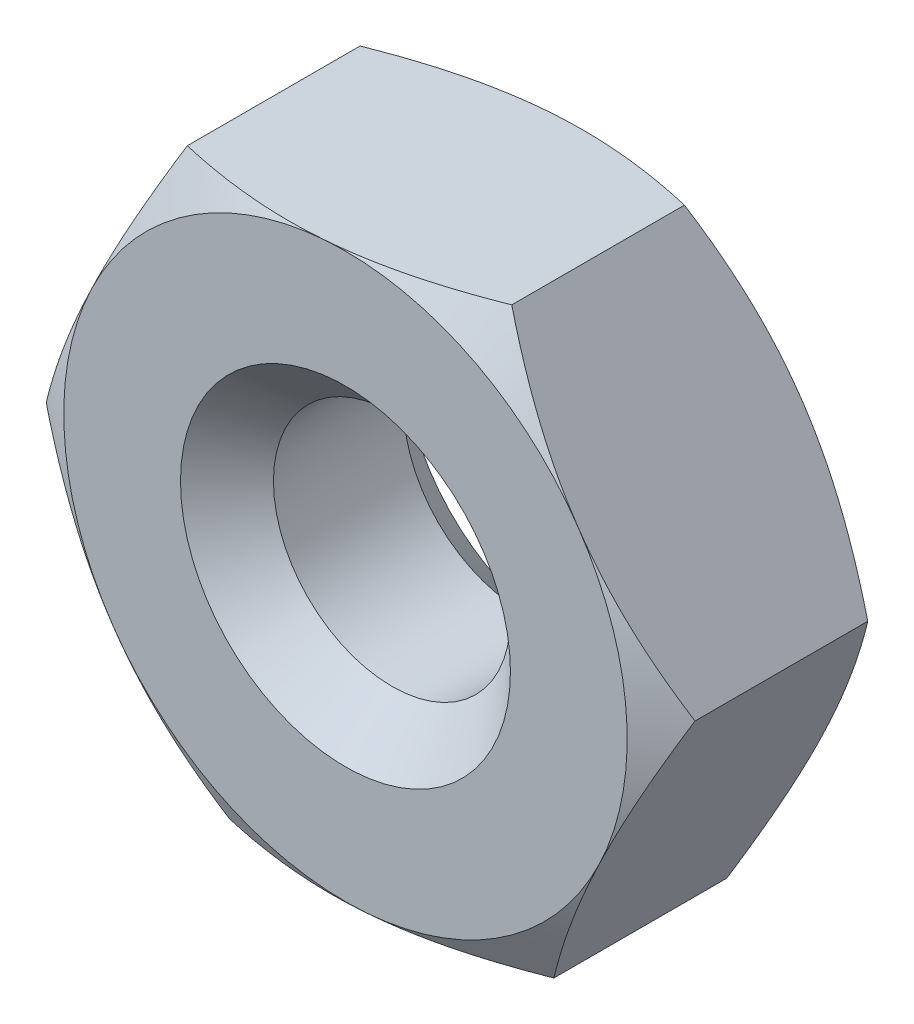
ISO-10303-21;
HEADER;
FILE_DESCRIPTION(('STEP AP214'),'2;1');
FILE_NAME('part.step','',(''),(''),'','','');
FILE_SCHEMA(('AUTOMOTIVE_DESIGN { 1 0 10303 214 1 1 1 1 }'));
ENDSEC;
DATA;
#1=APPLICATION_CONTEXT('core data for automotive mechanical design processes');
#2=APPLICATION_PROTOCOL_DEFINITION('international standard','automotive_design',2000,#1);
#3=PRODUCT_CONTEXT('',#1,'mechanical');
#4=PRODUCT('Part','Part','',(#3));
#5=PRODUCT_RELATED_PRODUCT_CATEGORY('part','',(#4));
#6=PRODUCT_DEFINITION_FORMATION('','',#4);
#7=PRODUCT_DEFINITION_CONTEXT('part definition',#1,'design');
#8=PRODUCT_DEFINITION('design','',#6,#7);
#9=PRODUCT_DEFINITION_SHAPE('','',#8);
#10=(LENGTH_UNIT() NAMED_UNIT(*) SI_UNIT(.MILLI.,.METRE.));
#11=(NAMED_UNIT(*) PLANE_ANGLE_UNIT() SI_UNIT($,.RADIAN.));
#12=(NAMED_UNIT(*) SI_UNIT($,.STERADIAN.) SOLID_ANGLE_UNIT());
#13=UNCERTAINTY_MEASURE_WITH_UNIT(LENGTH_MEASURE(1.E-05),#10,'distance_accuracy_value','');
#14=(GEOMETRIC_REPRESENTATION_CONTEXT(3) GLOBAL_UNCERTAINTY_ASSIGNED_CONTEXT((#13)) GLOBAL_UNIT_ASSIGNED_CONTEXT((#10,
#11,#12)) REPRESENTATION_CONTEXT('',''));
#15=CARTESIAN_POINT('',(0.,0.,0.));
#16=DIRECTION('',(0.,0.,1.));
#17=DIRECTION('',(1.,0.,0.));
#18=AXIS2_PLACEMENT_3D('',#15,#16,#17);
#19=CARTESIAN_POINT('',(3.49015866216891,0.262283268409103,2.4));
#20=DIRECTION('',(-0.826121265849152,-0.563492372718385,0.));
#21=DIRECTION('',(0.563492372718385,-0.826121265849152,0.));
#22=AXIS2_PLACEMENT_3D('',#19,#20,#21);
#23=PLANE('',#22);
#24=CARTESIAN_POINT('',(1.51779893885117,3.15390769888113,0.270795832655984));
#25=CARTESIAN_POINT('',(1.60446851110771,3.02684373100918,0.226377888360156));
#26=CARTESIAN_POINT('',(1.69188620879752,2.898682956224,0.185981216004486));
#27=CARTESIAN_POINT('',(1.86823537079749,2.64014211344375,0.11546802554396));
#28=CARTESIAN_POINT('',(1.95716996886114,2.50975745113557,0.085376453091123));
#29=CARTESIAN_POINT('',(2.13393697396114,2.2506040196364,0.0385339981108596));
#30=CARTESIAN_POINT('',(2.22174218137217,2.12187512709681,0.0214713634114672));
#31=CARTESIAN_POINT('',(2.39776580375113,1.86381154934589,0.00110118863020623));
#32=CARTESIAN_POINT('',(2.48598357881127,1.73447780228646,-0.00222321872384832));
#33=CARTESIAN_POINT('',(2.65082700847021,1.49280520941745,0.00468831345945599));
#34=CARTESIAN_POINT('',(2.72747732462637,1.38043020795082,0.0132272360881123));
#35=CARTESIAN_POINT('',(2.88027857454631,1.15641233633665,0.0402919721000541));
#36=CARTESIAN_POINT('',(2.95642897969903,1.0447702411718,0.0588270331292646));
#37=CARTESIAN_POINT('',(3.10954534227339,0.820290391228264,0.105163788200715));
#38=CARTESIAN_POINT('',(3.18649191783216,0.70748105168617,0.133161925597926));
#39=CARTESIAN_POINT('',(3.33923734968145,0.483545013469251,0.19670689328355));
#40=CARTESIAN_POINT('',(3.41503816325928,0.37241544526725,0.232238790192095));
#41=CARTESIAN_POINT('',(3.4902950809723,0.262083268409103,0.270795832655984));
#42=B_SPLINE_CURVE_WITH_KNOTS('',3,(#24,#25,#26,#27,#28,#29,#30,#31,#32,#33,#34,#35,#36,#37,#38,
#39,#40,#41),.UNSPECIFIED.,.F.,.F.,(4,2,2,2,2,2,2,2,4),(0.,0.480468435576784,0.96209185764543,
1.43179497545154,1.9009212380191,2.30941743115684,2.71829218293029,3.1362371228918,
3.55336123263816),.UNSPECIFIED.);
#43=CARTESIAN_POINT('',(1.51793535765456,3.15370769888113,0.270725942163688));
#44=VERTEX_POINT('',#43);
#45=CARTESIAN_POINT('',(2.50404700991173,1.70799548364512,0.));
#46=VERTEX_POINT('',#45);
#47=EDGE_CURVE('E124',#44,#46,#42,.T.);
#48=ORIENTED_EDGE('',*,*,#47,.F.);
#49=DIRECTION('',(0.,0.,-1.));
#50=VECTOR('',#49,1.);
#51=CARTESIAN_POINT('',(1.51793535765456,3.15370769888113,2.4));
#52=LINE('',#51,#50);
#53=CARTESIAN_POINT('',(1.51793535765456,3.15370769888113,2.12927405783631));
#54=VERTEX_POINT('',#53);
#55=EDGE_CURVE('E247',#54,#44,#52,.T.);
#56=ORIENTED_EDGE('',*,*,#55,.F.);
#57=CARTESIAN_POINT('',(3.4902950809723,0.262083268409103,2.12920416734402));
#58=CARTESIAN_POINT('',(3.40362550871575,0.389147236281054,2.17362211163984));
#59=CARTESIAN_POINT('',(3.31620781102594,0.51730801106624,2.21401878399551));
#60=CARTESIAN_POINT('',(3.13985864902597,0.775848853846483,2.28453197445604));
#61=CARTESIAN_POINT('',(3.05092405096233,0.906233516154665,2.31462354690888));
#62=CARTESIAN_POINT('',(2.87415704586232,1.16538694765383,2.36146600188914));
#63=CARTESIAN_POINT('',(2.7863518384513,1.29411584019342,2.37852863658853));
#64=CARTESIAN_POINT('',(2.61032821607233,1.55217941794435,2.39889881136979));
#65=CARTESIAN_POINT('',(2.5221104410122,1.68151316500377,2.40222321872385));
#66=CARTESIAN_POINT('',(2.35726701135325,1.92318575787279,2.39531168654054));
#67=CARTESIAN_POINT('',(2.28061669519709,2.03556075933942,2.38677276391189));
#68=CARTESIAN_POINT('',(2.12781544527715,2.25957863095359,2.35970802789995));
#69=CARTESIAN_POINT('',(2.05166504012443,2.37122072611843,2.34117296687074));
#70=CARTESIAN_POINT('',(1.89854867755007,2.59570057606197,2.29483621179928));
#71=CARTESIAN_POINT('',(1.8216021019913,2.70850991560407,2.26683807440207));
#72=CARTESIAN_POINT('',(1.66885667014201,2.93244595382099,2.20329310671645));
#73=CARTESIAN_POINT('',(1.59305585656418,3.04357552202299,2.1677612098079));
#74=CARTESIAN_POINT('',(1.51779893885117,3.15390769888113,2.12920416734402));
#75=B_SPLINE_CURVE_WITH_KNOTS('',3,(#57,#58,#59,#60,#61,#62,#63,#64,#65,#66,#67,#68,#69,#70,#71,
#72,#73,#74),.UNSPECIFIED.,.F.,.F.,(4,2,2,2,2,2,2,2,4),(0.,0.480468435576785,0.962091857645429,
1.43179497545154,1.90092123801909,2.30941743115684,2.71829218293029,3.1362371228918,
3.55336123263816),.UNSPECIFIED.);
#76=CARTESIAN_POINT('',(2.50404700991173,1.70799548364512,2.4));
#77=VERTEX_POINT('',#76);
#78=EDGE_CURVE('E228',#77,#54,#75,.T.);
#79=ORIENTED_EDGE('',*,*,#78,.F.);
#80=CARTESIAN_POINT('',(3.49015866216891,0.262283268409102,2.12927405783631));
#81=VERTEX_POINT('',#80);
#82=EDGE_CURVE('E233',#81,#77,#75,.T.);
#83=ORIENTED_EDGE('',*,*,#82,.F.);
#84=DIRECTION('',(0.,0.,-1.));
#85=VECTOR('',#84,1.);
#86=CARTESIAN_POINT('',(3.49015866216891,0.262283268409103,2.4));
#87=LINE('',#86,#85);
#88=CARTESIAN_POINT('',(3.49015866216891,0.262283268409103,0.270725942163688));
#89=VERTEX_POINT('',#88);
#90=EDGE_CURVE('E154',#81,#89,#87,.T.);
#91=ORIENTED_EDGE('',*,*,#90,.T.);
#92=EDGE_CURVE('E136',#46,#89,#42,.T.);
#93=ORIENTED_EDGE('',*,*,#92,.F.);
#94=EDGE_LOOP('',(#48,#56,#79,#83,#91,#93));
#95=FACE_BOUND('',#94,.T.);
#96=ADVANCED_FACE('F35',(#95),#23,.F.);
#97=CARTESIAN_POINT('',(1.51793535765456,3.15370769888113,2.4));
#98=DIRECTION('',(0.0749380766883149,-0.997188189191116,0.));
#99=DIRECTION('',(0.997188189191116,0.0749380766883149,0.));
#100=AXIS2_PLACEMENT_3D('',#97,#98,#99);
#101=PLANE('',#100);
#102=CARTESIAN_POINT('',(-1.97242330451435,2.89140940059552,0.270783842476596));
#103=CARTESIAN_POINT('',(-1.81904859325783,2.90293541544284,0.226366882893946));
#104=CARTESIAN_POINT('',(-1.66434996112251,2.91456092212673,0.185971256475435));
#105=CARTESIAN_POINT('',(-1.35227391838902,2.93801324404193,0.11546023685221));
#106=CARTESIAN_POINT('',(-1.19489096257049,2.94984047599314,0.0853697879345379));
#107=CARTESIAN_POINT('',(-0.88207552036306,2.97334836332225,0.0385295540985408));
#108=CARTESIAN_POINT('',(-0.726691164900777,2.98502540169075,0.02146802378493));
#109=CARTESIAN_POINT('',(-0.415191303979135,3.00843442389856,0.00109998357840421));
#110=CARTESIAN_POINT('',(-0.259076930764746,3.02016632265037,-0.00222339268335108));
#111=CARTESIAN_POINT('',(0.0326323891805468,3.04208809792379,0.00468976922606865));
#112=CARTESIAN_POINT('',(0.16827099997546,3.05228125577285,0.0132288914792515));
#113=CARTESIAN_POINT('',(0.438664535414926,3.07260116300242,0.0402930871421212));
#114=CARTESIAN_POINT('',(0.573418524795524,3.08272784209842,0.0588274060509915));
#115=CARTESIAN_POINT('',(0.844369576771844,3.10308964635149,0.105161844410828));
#116=CARTESIAN_POINT('',(0.980532345541723,3.11332219434872,0.13315837740453));
#117=CARTESIAN_POINT('',(1.25082702658867,3.13363467273174,0.196699526642058));
#118=CARTESIAN_POINT('',(1.38496240184229,3.14371486335807,0.232229212535161));
#119=CARTESIAN_POINT('',(1.51813535765456,3.15372272875764,0.270783842476596));
#120=B_SPLINE_CURVE_WITH_KNOTS('',3,(#102,#103,#104,#105,#106,#107,#108,#109,#110,#111,#112,
#113,#114,#115,#116,#117,#118,#119),.UNSPECIFIED.,.F.,.F.,(4,2,2,2,2,2,2,2,4),(0.,
0.480465591757972,0.962086092129981,1.43178663784245,1.90091035935246,2.30938817348878,
2.71824447695766,3.13616999231973,3.55327481524738),.UNSPECIFIED.);
#121=CARTESIAN_POINT('',(-1.97222330451435,2.89142443047203,0.270725942163687));
#122=VERTEX_POINT('',#121);
#123=CARTESIAN_POINT('',(-0.227143973429895,3.02256606467658,0.));
#124=VERTEX_POINT('',#123);
#125=EDGE_CURVE('E51',#122,#124,#120,.T.);
#126=ORIENTED_EDGE('',*,*,#125,.F.);
#127=DIRECTION('',(0.,0.,-1.));
#128=VECTOR('',#127,1.);
#129=CARTESIAN_POINT('',(-1.97222330451435,2.89142443047203,2.4));
#130=LINE('',#129,#128);
#131=CARTESIAN_POINT('',(-1.97222330451435,2.89142443047203,2.12927405783631));
#132=VERTEX_POINT('',#131);
#133=EDGE_CURVE('E244',#132,#122,#130,.T.);
#134=ORIENTED_EDGE('',*,*,#133,.F.);
#135=CARTESIAN_POINT('',(1.51813535765456,3.15372272875764,2.1292161575234));
#136=CARTESIAN_POINT('',(1.36476064639804,3.14219671391032,2.17363311710605));
#137=CARTESIAN_POINT('',(1.21006201426272,3.13057120722643,2.21402874352456));
#138=CARTESIAN_POINT('',(0.897985971529233,3.10711888531123,2.28453976314779));
#139=CARTESIAN_POINT('',(0.740603015710699,3.09529165336003,2.31463021206546));
#140=CARTESIAN_POINT('',(0.42778757350327,3.07178376603091,2.36147044590146));
#141=CARTESIAN_POINT('',(0.272403218040987,3.06010672766242,2.37853197621507));
#142=CARTESIAN_POINT('',(-0.0390966428806546,3.0366977054546,2.3989000164216));
#143=CARTESIAN_POINT('',(-0.195211016095043,3.02496580670279,2.40222339268335));
#144=CARTESIAN_POINT('',(-0.486920336040337,3.00304403142937,2.39531023077393));
#145=CARTESIAN_POINT('',(-0.62255894683525,2.99285087358031,2.38677110852075));
#146=CARTESIAN_POINT('',(-0.892952482274716,2.97253096635074,2.35970691285788));
#147=CARTESIAN_POINT('',(-1.02770647165531,2.96240428725474,2.34117259394901));
#148=CARTESIAN_POINT('',(-1.29865752363163,2.94204248300167,2.29483815558917));
#149=CARTESIAN_POINT('',(-1.43482029240151,2.93180993500444,2.26684162259547));
#150=CARTESIAN_POINT('',(-1.70511497344846,2.91149745662143,2.20330047335794));
#151=CARTESIAN_POINT('',(-1.83925034870208,2.9014172659951,2.16777078746484));
#152=CARTESIAN_POINT('',(-1.97242330451435,2.89140940059552,2.1292161575234));
#153=B_SPLINE_CURVE_WITH_KNOTS('',3,(#135,#136,#137,#138,#139,#140,#141,#142,#143,#144,#145,
#146,#147,#148,#149,#150,#151,#152),.UNSPECIFIED.,.F.,.F.,(4,2,2,2,2,2,2,2,4),(0.,
0.480465591757972,0.962086092129981,1.43178663784245,1.90091035935246,2.30938817348878,
2.71824447695766,3.13616999231973,3.55327481524738),.UNSPECIFIED.);
#154=CARTESIAN_POINT('',(-0.227143973429895,3.02256606467658,2.4));
#155=VERTEX_POINT('',#154);
#156=EDGE_CURVE('E215',#155,#132,#153,.T.);
#157=ORIENTED_EDGE('',*,*,#156,.F.);
#158=EDGE_CURVE('E221',#54,#155,#153,.T.);
#159=ORIENTED_EDGE('',*,*,#158,.F.);
#160=ORIENTED_EDGE('',*,*,#55,.T.);
#161=EDGE_CURVE('E130',#124,#44,#120,.T.);
#162=ORIENTED_EDGE('',*,*,#161,.F.);
#163=EDGE_LOOP('',(#126,#134,#157,#159,#160,#162));
#164=FACE_BOUND('',#163,.T.);
#165=ADVANCED_FACE('F207',(#164),#101,.F.);
#166=CARTESIAN_POINT('',(-1.97222330451435,2.89142443047203,2.4));
#167=DIRECTION('',(0.901059342537467,-0.43369581647273,0.));
#168=DIRECTION('',(0.43369581647273,0.901059342537467,0.));
#169=AXIS2_PLACEMENT_3D('',#166,#167,#168);
#170=PLANE('',#169);
#171=CARTESIAN_POINT('',(-3.49025492571027,-0.262483268409103,0.270790019822239));
#172=CARTESIAN_POINT('',(-3.4235492351293,-0.123893539351442,0.226372552912387));
#173=CARTESIAN_POINT('',(-3.35626774556123,0.0158924868274834,0.185976387623851));
#174=CARTESIAN_POINT('',(-3.22053970001612,0.297885115848987,0.11546424957888));
#175=CARTESIAN_POINT('',(-3.15209073221846,0.440096729561893,0.0853732218127283));
#176=CARTESIAN_POINT('',(-3.01604109915238,0.722757498392937,0.0385318436373238));
#177=CARTESIAN_POINT('',(-2.94846136761517,0.863163160967743,0.0214697443413987));
#178=CARTESIAN_POINT('',(-2.81298389452975,1.14463519318565,0.00110060439729786));
#179=CARTESIAN_POINT('',(-2.74508664545469,1.28570053965187,-0.0022233030851216));
#180=CARTESIAN_POINT('',(-2.61821523133095,1.54929236750693,0.00468901919525455));
#181=CARTESIAN_POINT('',(-2.55922208079619,1.67185829370696,0.0132280386080687));
#182=CARTESIAN_POINT('',(-2.44162012244292,1.91619162423514,0.0402925126680461));
#183=CARTESIAN_POINT('',(-2.38301172143219,2.0379581833673,0.0588272139203565));
#184=CARTESIAN_POINT('',(-2.2651672607429,2.28279534396984,0.105162845853977));
#185=CARTESIAN_POINT('',(-2.20594611730632,2.40583495501168,0.133160205436981));
#186=CARTESIAN_POINT('',(-2.08838713565012,2.65007899587429,0.19670332193979));
#187=CARTESIAN_POINT('',(-2.03004779114899,2.77128655519038,0.232234146948302));
#188=CARTESIAN_POINT('',(-1.97212704097298,2.89162443047203,0.27079001982224));
#189=B_SPLINE_CURVE_WITH_KNOTS('',3,(#171,#172,#173,#174,#175,#176,#177,#178,#179,#180,#181,
#182,#183,#184,#185,#186,#187,#188),.UNSPECIFIED.,.F.,.F.,(4,2,2,2,2,2,2,2,4),(0.,
0.480467056895051,0.962089062526838,1.43179093338297,1.90091596404688,2.30940324709977,
2.71826905518946,3.13620457815475,3.5533193377024),.UNSPECIFIED.);
#190=CARTESIAN_POINT('',(-3.4901586621689,-0.262283268409103,0.270725942163686));
#191=VERTEX_POINT('',#190);
#192=CARTESIAN_POINT('',(-2.73119098334162,1.31457058103146,0.));
#193=VERTEX_POINT('',#192);
#194=EDGE_CURVE('E58',#191,#193,#189,.T.);
#195=ORIENTED_EDGE('',*,*,#194,.F.);
#196=DIRECTION('',(0.,0.,-1.));
#197=VECTOR('',#196,1.);
#198=CARTESIAN_POINT('',(-3.4901586621689,-0.262283268409103,2.4));
#199=LINE('',#198,#197);
#200=CARTESIAN_POINT('',(-3.4901586621689,-0.262283268409103,2.12927405783631));
#201=VERTEX_POINT('',#200);
#202=EDGE_CURVE('E241',#201,#191,#199,.T.);
#203=ORIENTED_EDGE('',*,*,#202,.F.);
#204=CARTESIAN_POINT('',(-1.97212704097298,2.89162443047203,2.12920998017776));
#205=CARTESIAN_POINT('',(-2.03883273155395,2.75303470141437,2.17362744708761));
#206=CARTESIAN_POINT('',(-2.10611422112202,2.61324867523544,2.21402361237615));
#207=CARTESIAN_POINT('',(-2.24184226666713,2.33125604621394,2.28453575042112));
#208=CARTESIAN_POINT('',(-2.31029123446479,2.18904443250103,2.31462677818727));
#209=CARTESIAN_POINT('',(-2.44634086753087,1.90638366366999,2.36146815636268));
#210=CARTESIAN_POINT('',(-2.51392059906808,1.76597800109518,2.3785302556586));
#211=CARTESIAN_POINT('',(-2.6493980721535,1.48450596887727,2.3988993956027));
#212=CARTESIAN_POINT('',(-2.71729532122856,1.34344062241105,2.40222330308512));
#213=CARTESIAN_POINT('',(-2.8441667353523,1.079848794556,2.39531098080475));
#214=CARTESIAN_POINT('',(-2.90315988588706,0.957282868355963,2.38677196139193));
#215=CARTESIAN_POINT('',(-3.02076184424033,0.712949537827787,2.35970748733195));
#216=CARTESIAN_POINT('',(-3.07937024525106,0.591182978695624,2.34117278607964));
#217=CARTESIAN_POINT('',(-3.19721470594035,0.346345818093092,2.29483715414602));
#218=CARTESIAN_POINT('',(-3.25643584937693,0.223306207051248,2.26683979456302));
#219=CARTESIAN_POINT('',(-3.37399483103313,-0.0209378338113594,2.20329667806021));
#220=CARTESIAN_POINT('',(-3.43233417553426,-0.142145393127453,2.1677658530517));
#221=CARTESIAN_POINT('',(-3.49025492571027,-0.262483268409104,2.12920998017776));
#222=B_SPLINE_CURVE_WITH_KNOTS('',3,(#204,#205,#206,#207,#208,#209,#210,#211,#212,#213,#214,
#215,#216,#217,#218,#219,#220,#221),.UNSPECIFIED.,.F.,.F.,(4,2,2,2,2,2,2,2,4),(0.,
0.480467056895051,0.962089062526838,1.43179093338297,1.90091596404688,2.30940324709977,
2.71826905518946,3.13620457815475,3.5533193377024),.UNSPECIFIED.);
#223=CARTESIAN_POINT('',(-2.73119098334163,1.31457058103146,2.4));
#224=VERTEX_POINT('',#223);
#225=EDGE_CURVE('E223',#224,#201,#222,.T.);
#226=ORIENTED_EDGE('',*,*,#225,.F.);
#227=EDGE_CURVE('E222',#132,#224,#222,.T.);
#228=ORIENTED_EDGE('',*,*,#227,.F.);
#229=ORIENTED_EDGE('',*,*,#133,.T.);
#230=EDGE_CURVE('E201',#193,#122,#189,.T.);
#231=ORIENTED_EDGE('',*,*,#230,.F.);
#232=EDGE_LOOP('',(#195,#203,#226,#228,#229,#231));
#233=FACE_BOUND('',#232,.T.);
#234=ADVANCED_FACE('F210',(#233),#170,.F.);
#235=CARTESIAN_POINT('',(-3.4901586621689,-0.262283268409103,2.4));
#236=DIRECTION('',(0.826121265849152,0.563492372718385,0.));
#237=DIRECTION('',(-0.563492372718385,0.826121265849152,0.));
#238=AXIS2_PLACEMENT_3D('',#235,#236,#237);
#239=PLANE('',#238);
#240=CARTESIAN_POINT('',(-1.51779893885116,-3.15390769888113,0.270795832655984));
#241=CARTESIAN_POINT('',(-1.6044685111077,-3.02684373100918,0.226377888360156));
#242=CARTESIAN_POINT('',(-1.69188620879752,-2.898682956224,0.185981216004486));
#243=CARTESIAN_POINT('',(-1.86823537079749,-2.64014211344375,0.11546802554396));
#244=CARTESIAN_POINT('',(-1.95716996886113,-2.50975745113557,0.0853764530911227));
#245=CARTESIAN_POINT('',(-2.13393697396114,-2.2506040196364,0.038533998110859));
#246=CARTESIAN_POINT('',(-2.22174218137216,-2.12187512709681,0.0214713634114664));
#247=CARTESIAN_POINT('',(-2.39776580375113,-1.86381154934589,0.00110118863020523));
#248=CARTESIAN_POINT('',(-2.48598357881126,-1.73447780228646,-0.00222321872384934));
#249=CARTESIAN_POINT('',(-2.65082700847021,-1.49280520941745,0.00468831345945502));
#250=CARTESIAN_POINT('',(-2.72747732462637,-1.38043020795082,0.0132272360881114));
#251=CARTESIAN_POINT('',(-2.88027857454631,-1.15641233633665,0.0402919721000531));
#252=CARTESIAN_POINT('',(-2.95642897969903,-1.0447702411718,0.0588270331292635));
#253=CARTESIAN_POINT('',(-3.10954534227339,-0.820290391228265,0.105163788200714));
#254=CARTESIAN_POINT('',(-3.18649191783216,-0.707481051686171,0.133161925597925));
#255=CARTESIAN_POINT('',(-3.33923734968145,-0.483545013469251,0.196706893283549));
#256=CARTESIAN_POINT('',(-3.41503816325928,-0.372415445267251,0.232238790192094));
#257=CARTESIAN_POINT('',(-3.49029508097229,-0.262083268409103,0.270795832655983));
#258=B_SPLINE_CURVE_WITH_KNOTS('',3,(#240,#241,#242,#243,#244,#245,#246,#247,#248,#249,#250,
#251,#252,#253,#254,#255,#256,#257),.UNSPECIFIED.,.F.,.F.,(4,2,2,2,2,2,2,2,4),(0.,
0.480468435576784,0.962091857645429,1.43179497545154,1.90092123801909,2.30941743115684,
2.71829218293029,3.1362371228918,3.55336123263816),.UNSPECIFIED.);
#259=CARTESIAN_POINT('',(-1.51793535765455,-3.15370769888113,0.270725942163687));
#260=VERTEX_POINT('',#259);
#261=CARTESIAN_POINT('',(-2.50404700991173,-1.70799548364512,0.));
#262=VERTEX_POINT('',#261);
#263=EDGE_CURVE('E168',#260,#262,#258,.T.);
#264=ORIENTED_EDGE('',*,*,#263,.F.);
#265=DIRECTION('',(0.,0.,-1.));
#266=VECTOR('',#265,1.);
#267=CARTESIAN_POINT('',(-1.51793535765455,-3.15370769888113,2.4));
#268=LINE('',#267,#266);
#269=CARTESIAN_POINT('',(-1.51793535765455,-3.15370769888113,2.12927405783631));
#270=VERTEX_POINT('',#269);
#271=EDGE_CURVE('E238',#270,#260,#268,.T.);
#272=ORIENTED_EDGE('',*,*,#271,.F.);
#273=CARTESIAN_POINT('',(-3.49029508097229,-0.262083268409103,2.12920416734402));
#274=CARTESIAN_POINT('',(-3.40362550871575,-0.389147236281054,2.17362211163984));
#275=CARTESIAN_POINT('',(-3.31620781102594,-0.517308011066241,2.21401878399551));
#276=CARTESIAN_POINT('',(-3.13985864902597,-0.775848853846483,2.28453197445604));
#277=CARTESIAN_POINT('',(-3.05092405096232,-0.906233516154665,2.31462354690888));
#278=CARTESIAN_POINT('',(-2.87415704586232,-1.16538694765383,2.36146600188914));
#279=CARTESIAN_POINT('',(-2.7863518384513,-1.29411584019342,2.37852863658853));
#280=CARTESIAN_POINT('',(-2.61032821607233,-1.55217941794435,2.39889881136979));
#281=CARTESIAN_POINT('',(-2.52211044101219,-1.68151316500377,2.40222321872385));
#282=CARTESIAN_POINT('',(-2.35726701135325,-1.92318575787279,2.39531168654054));
#283=CARTESIAN_POINT('',(-2.28061669519709,-2.03556075933942,2.38677276391189));
#284=CARTESIAN_POINT('',(-2.12781544527715,-2.25957863095359,2.35970802789995));
#285=CARTESIAN_POINT('',(-2.05166504012443,-2.37122072611843,2.34117296687074));
#286=CARTESIAN_POINT('',(-1.89854867755007,-2.59570057606197,2.29483621179928));
#287=CARTESIAN_POINT('',(-1.8216021019913,-2.70850991560407,2.26683807440207));
#288=CARTESIAN_POINT('',(-1.66885667014201,-2.93244595382099,2.20329310671645));
#289=CARTESIAN_POINT('',(-1.59305585656418,-3.04357552202299,2.1677612098079));
#290=CARTESIAN_POINT('',(-1.51779893885116,-3.15390769888113,2.12920416734402));
#291=B_SPLINE_CURVE_WITH_KNOTS('',3,(#273,#274,#275,#276,#277,#278,#279,#280,#281,#282,#283,
#284,#285,#286,#287,#288,#289,#290),.UNSPECIFIED.,.F.,.F.,(4,2,2,2,2,2,2,2,4),(0.,
0.480468435576783,0.962091857645429,1.43179497545154,1.90092123801909,2.30941743115684,
2.71829218293029,3.1362371228918,3.55336123263816),.UNSPECIFIED.);
#292=CARTESIAN_POINT('',(-2.50404700991173,-1.70799548364512,2.4));
#293=VERTEX_POINT('',#292);
#294=EDGE_CURVE('E285',#293,#270,#291,.T.);
#295=ORIENTED_EDGE('',*,*,#294,.F.);
#296=EDGE_CURVE('E289',#201,#293,#291,.T.);
#297=ORIENTED_EDGE('',*,*,#296,.F.);
#298=ORIENTED_EDGE('',*,*,#202,.T.);
#299=EDGE_CURVE('E331',#262,#191,#258,.T.);
#300=ORIENTED_EDGE('',*,*,#299,.F.);
#301=EDGE_LOOP('',(#264,#272,#295,#297,#298,#300));
#302=FACE_BOUND('',#301,.T.);
#303=ADVANCED_FACE('F274',(#302),#239,.F.);
#304=CARTESIAN_POINT('',(-1.51793535765455,-3.15370769888113,2.4));
#305=DIRECTION('',(-0.074938076688315,0.997188189191116,0.));
#306=DIRECTION('',(-0.997188189191116,-0.074938076688315,0.));
#307=AXIS2_PLACEMENT_3D('',#304,#305,#306);
#308=PLANE('',#307);
#309=CARTESIAN_POINT('',(1.97242330451435,-2.89140940059552,0.270783842476597));
#310=CARTESIAN_POINT('',(1.81904859325783,-2.90293541544284,0.226366882893947));
#311=CARTESIAN_POINT('',(1.66434996112252,-2.91456092212673,0.185971256475435));
#312=CARTESIAN_POINT('',(1.35227391838903,-2.93801324404193,0.11546023685221));
#313=CARTESIAN_POINT('',(1.19489096257049,-2.94984047599314,0.0853697879345385));
#314=CARTESIAN_POINT('',(0.882075520363063,-2.97334836332225,0.0385295540985413));
#315=CARTESIAN_POINT('',(0.72669116490078,-2.98502540169075,0.0214680237849304));
#316=CARTESIAN_POINT('',(0.415191303979138,-3.00843442389856,0.00109998357840446));
#317=CARTESIAN_POINT('',(0.259076930764749,-3.02016632265037,-0.00222339268335091));
#318=CARTESIAN_POINT('',(-0.0326323891805449,-3.04208809792379,0.00468976922606877));
#319=CARTESIAN_POINT('',(-0.168270999975458,-3.05228125577285,0.0132288914792517));
#320=CARTESIAN_POINT('',(-0.438664535414924,-3.07260116300243,0.0402930871421214));
#321=CARTESIAN_POINT('',(-0.573418524795522,-3.08272784209842,0.0588274060509918));
#322=CARTESIAN_POINT('',(-0.844369576771842,-3.10308964635149,0.105161844410828));
#323=CARTESIAN_POINT('',(-0.980532345541721,-3.11332219434872,0.13315837740453));
#324=CARTESIAN_POINT('',(-1.25082702658867,-3.13363467273174,0.196699526642057));
#325=CARTESIAN_POINT('',(-1.38496240184229,-3.14371486335807,0.23222921253516));
#326=CARTESIAN_POINT('',(-1.51813535765455,-3.15372272875764,0.270783842476596));
#327=B_SPLINE_CURVE_WITH_KNOTS('',3,(#309,#310,#311,#312,#313,#314,#315,#316,#317,#318,#319,
#320,#321,#322,#323,#324,#325,#326),.UNSPECIFIED.,.F.,.F.,(4,2,2,2,2,2,2,2,4),(0.,
0.480465591757972,0.962086092129981,1.43178663784245,1.90091035935246,2.30938817348878,
2.71824447695766,3.13616999231973,3.55327481524738),.UNSPECIFIED.);
#328=CARTESIAN_POINT('',(1.97222330451435,-2.89142443047203,0.270725942163688));
#329=VERTEX_POINT('',#328);
#330=CARTESIAN_POINT('',(0.227143973429895,-3.02256606467658,0.));
#331=VERTEX_POINT('',#330);
#332=EDGE_CURVE('E155',#329,#331,#327,.T.);
#333=ORIENTED_EDGE('',*,*,#332,.F.);
#334=DIRECTION('',(0.,0.,-1.));
#335=VECTOR('',#334,1.);
#336=CARTESIAN_POINT('',(1.97222330451435,-2.89142443047203,2.4));
#337=LINE('',#336,#335);
#338=CARTESIAN_POINT('',(1.97222330451435,-2.89142443047203,2.12927405783631));
#339=VERTEX_POINT('',#338);
#340=EDGE_CURVE('E235',#339,#329,#337,.T.);
#341=ORIENTED_EDGE('',*,*,#340,.F.);
#342=CARTESIAN_POINT('',(-1.51813535765455,-3.15372272875764,2.1292161575234));
#343=CARTESIAN_POINT('',(-1.36476064639804,-3.14219671391032,2.17363311710605));
#344=CARTESIAN_POINT('',(-1.21006201426272,-3.13057120722643,2.21402874352457));
#345=CARTESIAN_POINT('',(-0.897985971529231,-3.10711888531123,2.28453976314779));
#346=CARTESIAN_POINT('',(-0.740603015710697,-3.09529165336003,2.31463021206546));
#347=CARTESIAN_POINT('',(-0.427787573503269,-3.07178376603091,2.36147044590146));
#348=CARTESIAN_POINT('',(-0.272403218040986,-3.06010672766242,2.37853197621507));
#349=CARTESIAN_POINT('',(0.0390966428806565,-3.0366977054546,2.3989000164216));
#350=CARTESIAN_POINT('',(0.195211016095045,-3.02496580670279,2.40222339268335));
#351=CARTESIAN_POINT('',(0.486920336040339,-3.00304403142937,2.39531023077393));
#352=CARTESIAN_POINT('',(0.622558946835252,-2.99285087358031,2.38677110852075));
#353=CARTESIAN_POINT('',(0.892952482274718,-2.97253096635074,2.35970691285788));
#354=CARTESIAN_POINT('',(1.02770647165532,-2.96240428725474,2.34117259394901));
#355=CARTESIAN_POINT('',(1.29865752363164,-2.94204248300167,2.29483815558917));
#356=CARTESIAN_POINT('',(1.43482029240152,-2.93180993500444,2.26684162259547));
#357=CARTESIAN_POINT('',(1.70511497344846,-2.91149745662143,2.20330047335794));
#358=CARTESIAN_POINT('',(1.83925034870208,-2.9014172659951,2.16777078746484));
#359=CARTESIAN_POINT('',(1.97242330451435,-2.89140940059552,2.1292161575234));
#360=B_SPLINE_CURVE_WITH_KNOTS('',3,(#342,#343,#344,#345,#346,#347,#348,#349,#350,#351,#352,
#353,#354,#355,#356,#357,#358,#359),.UNSPECIFIED.,.F.,.F.,(4,2,2,2,2,2,2,2,4),(0.,
0.480465591757972,0.962086092129981,1.43178663784245,1.90091035935246,2.30938817348878,
2.71824447695766,3.13616999231973,3.55327481524738),.UNSPECIFIED.);
#361=CARTESIAN_POINT('',(0.227143973429895,-3.02256606467658,2.4));
#362=VERTEX_POINT('',#361);
#363=EDGE_CURVE('E279',#362,#339,#360,.T.);
#364=ORIENTED_EDGE('',*,*,#363,.F.);
#365=EDGE_CURVE('E283',#270,#362,#360,.T.);
#366=ORIENTED_EDGE('',*,*,#365,.F.);
#367=ORIENTED_EDGE('',*,*,#271,.T.);
#368=EDGE_CURVE('E135',#331,#260,#327,.T.);
#369=ORIENTED_EDGE('',*,*,#368,.F.);
#370=EDGE_LOOP('',(#333,#341,#364,#366,#367,#369));
#371=FACE_BOUND('',#370,.T.);
#372=ADVANCED_FACE('F268',(#371),#308,.F.);
#373=CARTESIAN_POINT('',(1.97222330451435,-2.89142443047203,2.4));
#374=DIRECTION('',(-0.901059342537467,0.43369581647273,0.));
#375=DIRECTION('',(-0.43369581647273,-0.901059342537467,0.));
#376=AXIS2_PLACEMENT_3D('',#373,#374,#375);
#377=PLANE('',#376);
#378=CARTESIAN_POINT('',(3.49025492571027,0.262483268409103,0.27079001982224));
#379=CARTESIAN_POINT('',(3.4235492351293,0.123893539351441,0.226372552912388));
#380=CARTESIAN_POINT('',(3.35626774556123,-0.0158924868274837,0.185976387623853));
#381=CARTESIAN_POINT('',(3.22053970001612,-0.297885115848987,0.115464249578881));
#382=CARTESIAN_POINT('',(3.15209073221846,-0.440096729561894,0.0853732218127296));
#383=CARTESIAN_POINT('',(3.01604109915238,-0.722757498392938,0.0385318436373253));
#384=CARTESIAN_POINT('',(2.94846136761517,-0.863163160967744,0.0214697443414003));
#385=CARTESIAN_POINT('',(2.81298389452975,-1.14463519318565,0.00110060439729949));
#386=CARTESIAN_POINT('',(2.74508664545469,-1.28570053965188,-0.00222330308512022));
#387=CARTESIAN_POINT('',(2.61821523133095,-1.54929236750693,0.0046890191952558));
#388=CARTESIAN_POINT('',(2.5592220807962,-1.67185829370697,0.01322803860807));
#389=CARTESIAN_POINT('',(2.44162012244292,-1.91619162423514,0.0402925126680476));
#390=CARTESIAN_POINT('',(2.3830117214322,-2.0379581833673,0.058827213920358));
#391=CARTESIAN_POINT('',(2.2651672607429,-2.28279534396984,0.105162845853979));
#392=CARTESIAN_POINT('',(2.20594611730632,-2.40583495501168,0.133160205436982));
#393=CARTESIAN_POINT('',(2.08838713565012,-2.65007899587429,0.196703321939791));
#394=CARTESIAN_POINT('',(2.03004779114899,-2.77128655519038,0.232234146948303));
#395=CARTESIAN_POINT('',(1.97212704097298,-2.89162443047203,0.270790019822241));
#396=B_SPLINE_CURVE_WITH_KNOTS('',3,(#378,#379,#380,#381,#382,#383,#384,#385,#386,#387,#388,
#389,#390,#391,#392,#393,#394,#395),.UNSPECIFIED.,.F.,.F.,(4,2,2,2,2,2,2,2,4),(0.,
0.480467056895051,0.962089062526838,1.43179093338297,1.90091596404688,2.30940324709977,
2.71826905518946,3.13620457815475,3.5533193377024),.UNSPECIFIED.);
#397=CARTESIAN_POINT('',(2.73119098334163,-1.31457058103146,0.));
#398=VERTEX_POINT('',#397);
#399=EDGE_CURVE('E142',#89,#398,#396,.T.);
#400=ORIENTED_EDGE('',*,*,#399,.F.);
#401=ORIENTED_EDGE('',*,*,#90,.F.);
#402=CARTESIAN_POINT('',(1.97212704097298,-2.89162443047203,2.12920998017776));
#403=CARTESIAN_POINT('',(2.03883273155395,-2.75303470141437,2.17362744708761));
#404=CARTESIAN_POINT('',(2.10611422112202,-2.61324867523544,2.21402361237615));
#405=CARTESIAN_POINT('',(2.24184226666713,-2.33125604621394,2.28453575042112));
#406=CARTESIAN_POINT('',(2.31029123446479,-2.18904443250103,2.31462677818727));
#407=CARTESIAN_POINT('',(2.44634086753087,-1.90638366366999,2.36146815636267));
#408=CARTESIAN_POINT('',(2.51392059906808,-1.76597800109518,2.3785302556586));
#409=CARTESIAN_POINT('',(2.6493980721535,-1.48450596887727,2.3988993956027));
#410=CARTESIAN_POINT('',(2.71729532122856,-1.34344062241105,2.40222330308512));
#411=CARTESIAN_POINT('',(2.8441667353523,-1.079848794556,2.39531098080474));
#412=CARTESIAN_POINT('',(2.90315988588706,-0.957282868355963,2.38677196139193));
#413=CARTESIAN_POINT('',(3.02076184424033,-0.712949537827787,2.35970748733195));
#414=CARTESIAN_POINT('',(3.07937024525106,-0.591182978695624,2.34117278607964));
#415=CARTESIAN_POINT('',(3.19721470594036,-0.346345818093092,2.29483715414602));
#416=CARTESIAN_POINT('',(3.25643584937693,-0.223306207051249,2.26683979456302));
#417=CARTESIAN_POINT('',(3.37399483103313,0.0209378338113587,2.20329667806021));
#418=CARTESIAN_POINT('',(3.43233417553427,0.142145393127453,2.1677658530517));
#419=CARTESIAN_POINT('',(3.49025492571027,0.262483268409103,2.12920998017776));
#420=B_SPLINE_CURVE_WITH_KNOTS('',3,(#402,#403,#404,#405,#406,#407,#408,#409,#410,#411,#412,
#413,#414,#415,#416,#417,#418,#419),.UNSPECIFIED.,.F.,.F.,(4,2,2,2,2,2,2,2,4),(0.,
0.480467056895051,0.962089062526838,1.43179093338297,1.90091596404688,2.30940324709977,
2.71826905518946,3.13620457815475,3.5533193377024),.UNSPECIFIED.);
#421=CARTESIAN_POINT('',(2.73119098334163,-1.31457058103146,2.4));
#422=VERTEX_POINT('',#421);
#423=EDGE_CURVE('E260',#422,#81,#420,.T.);
#424=ORIENTED_EDGE('',*,*,#423,.F.);
#425=EDGE_CURVE('E147',#339,#422,#420,.T.);
#426=ORIENTED_EDGE('',*,*,#425,.F.);
#427=ORIENTED_EDGE('',*,*,#340,.T.);
#428=EDGE_CURVE('E188',#398,#329,#396,.T.);
#429=ORIENTED_EDGE('',*,*,#428,.F.);
#430=EDGE_LOOP('',(#400,#401,#424,#426,#427,#429));
#431=FACE_BOUND('',#430,.T.);
#432=ADVANCED_FACE('F264',(#431),#377,.F.);
#433=CARTESIAN_POINT('',(0.,0.,0.));
#434=DIRECTION('',(0.,0.,1.));
#435=DIRECTION('',(1.,0.,0.));
#436=AXIS2_PLACEMENT_3D('',#433,#434,#435);
#437=PLANE('',#436);
#438=CARTESIAN_POINT('',(0.,0.,0.));
#439=DIRECTION('',(0.,0.,1.));
#440=DIRECTION('',(1.,0.,0.));
#441=AXIS2_PLACEMENT_3D('',#438,#439,#440);
#442=CIRCLE('',#441,1.775);
#443=CARTESIAN_POINT('',(1.775,0.,0.));
#444=VERTEX_POINT('',#443);
#445=EDGE_CURVE('E249',#444,#444,#442,.T.);
#446=ORIENTED_EDGE('',*,*,#445,.T.);
#447=EDGE_LOOP('',(#446));
#448=FACE_BOUND('',#447,.T.);
#449=CARTESIAN_POINT('',(0.,0.,0.));
#450=DIRECTION('',(0.,0.,1.));
#451=DIRECTION('',(1.,0.,0.));
#452=AXIS2_PLACEMENT_3D('',#449,#450,#451);
#453=CIRCLE('',#452,3.03108891324553);
#454=EDGE_CURVE('E11',#46,#124,#453,.T.);
#455=ORIENTED_EDGE('',*,*,#454,.F.);
#456=EDGE_CURVE('E39',#398,#46,#453,.T.);
#457=ORIENTED_EDGE('',*,*,#456,.F.);
#458=EDGE_CURVE('E146',#331,#398,#453,.T.);
#459=ORIENTED_EDGE('',*,*,#458,.F.);
#460=EDGE_CURVE('E519',#262,#331,#453,.T.);
#461=ORIENTED_EDGE('',*,*,#460,.F.);
#462=EDGE_CURVE('E44',#193,#262,#453,.T.);
#463=ORIENTED_EDGE('',*,*,#462,.F.);
#464=CARTESIAN_POINT('',(0.,0.,0.));
#465=DIRECTION('',(0.,0.,-1.));
#466=DIRECTION('',(-1.,0.,0.));
#467=AXIS2_PLACEMENT_3D('',#464,#465,#466);
#468=CIRCLE('',#467,3.03108891324553);
#469=EDGE_CURVE('E150',#193,#124,#468,.T.);
#470=ORIENTED_EDGE('',*,*,#469,.T.);
#471=EDGE_LOOP('',(#455,#457,#459,#461,#463,#470));
#472=FACE_BOUND('',#471,.T.);
#473=ADVANCED_FACE('F148',(#448,#472),#437,.F.);
#474=CARTESIAN_POINT('',(0.,0.,2.4));
#475=DIRECTION('',(0.,0.,1.));
#476=DIRECTION('',(1.,0.,0.));
#477=AXIS2_PLACEMENT_3D('',#474,#475,#476);
#478=PLANE('',#477);
#479=CARTESIAN_POINT('',(0.,0.,2.4));
#480=DIRECTION('',(0.,0.,1.));
#481=DIRECTION('',(1.,0.,0.));
#482=AXIS2_PLACEMENT_3D('',#479,#480,#481);
#483=CIRCLE('',#482,1.775);
#484=CARTESIAN_POINT('',(1.775,0.,2.4));
#485=VERTEX_POINT('',#484);
#486=EDGE_CURVE('E258',#485,#485,#483,.F.);
#487=ORIENTED_EDGE('',*,*,#486,.T.);
#488=EDGE_LOOP('',(#487));
#489=FACE_BOUND('',#488,.T.);
#490=CARTESIAN_POINT('',(0.,0.,2.4));
#491=DIRECTION('',(0.,0.,-1.));
#492=DIRECTION('',(-1.,0.,0.));
#493=AXIS2_PLACEMENT_3D('',#490,#491,#492);
#494=CIRCLE('',#493,3.03108891324553);
#495=EDGE_CURVE('E312',#77,#422,#494,.T.);
#496=ORIENTED_EDGE('',*,*,#495,.F.);
#497=EDGE_CURVE('E315',#155,#77,#494,.T.);
#498=ORIENTED_EDGE('',*,*,#497,.F.);
#499=EDGE_CURVE('E284',#224,#155,#494,.T.);
#500=ORIENTED_EDGE('',*,*,#499,.F.);
#501=EDGE_CURVE('E311',#293,#224,#494,.T.);
#502=ORIENTED_EDGE('',*,*,#501,.F.);
#503=EDGE_CURVE('E298',#362,#293,#494,.T.);
#504=ORIENTED_EDGE('',*,*,#503,.F.);
#505=EDGE_CURVE('E309',#422,#362,#494,.T.);
#506=ORIENTED_EDGE('',*,*,#505,.F.);
#507=EDGE_LOOP('',(#496,#498,#500,#502,#504,#506));
#508=FACE_BOUND('',#507,.T.);
#509=ADVANCED_FACE('F308',(#489,#508),#478,.T.);
#510=CARTESIAN_POINT('',(0.,0.,2.4));
#511=DIRECTION('',(0.,0.,-1.));
#512=DIRECTION('',(-1.,0.,0.));
#513=AXIS2_PLACEMENT_3D('',#510,#511,#512);
#514=CYLINDRICAL_SURFACE('',#513,1.275);
#515=CARTESIAN_POINT('',(0.,0.,0.500000000000002));
#516=DIRECTION('',(0.,0.,1.));
#517=DIRECTION('',(1.,0.,0.));
#518=AXIS2_PLACEMENT_3D('',#515,#516,#517);
#519=CIRCLE('',#518,1.275);
#520=CARTESIAN_POINT('',(1.275,0.,0.500000000000002));
#521=VERTEX_POINT('',#520);
#522=EDGE_CURVE('E255',#521,#521,#519,.F.);
#523=ORIENTED_EDGE('',*,*,#522,.T.);
#524=EDGE_LOOP('',(#523));
#525=FACE_BOUND('',#524,.T.);
#526=CARTESIAN_POINT('',(0.,0.,1.9));
#527=DIRECTION('',(0.,0.,1.));
#528=DIRECTION('',(1.,0.,0.));
#529=AXIS2_PLACEMENT_3D('',#526,#527,#528);
#530=CIRCLE('',#529,1.275);
#531=CARTESIAN_POINT('',(1.275,0.,1.9));
#532=VERTEX_POINT('',#531);
#533=EDGE_CURVE('E252',#532,#532,#530,.T.);
#534=ORIENTED_EDGE('',*,*,#533,.T.);
#535=EDGE_LOOP('',(#534));
#536=FACE_BOUND('',#535,.T.);
#537=ADVANCED_FACE('F392',(#525,#536),#514,.F.);
#538=CARTESIAN_POINT('',(0.,0.,0.));
#539=DIRECTION('',(0.,0.,-1.));
#540=DIRECTION('',(-1.,0.,0.));
#541=AXIS2_PLACEMENT_3D('',#538,#539,#540);
#542=CONICAL_SURFACE('',#541,1.775,0.785398163397447);
#543=ORIENTED_EDGE('',*,*,#522,.F.);
#544=EDGE_LOOP('',(#543));
#545=FACE_BOUND('',#544,.T.);
#546=ORIENTED_EDGE('',*,*,#445,.F.);
#547=EDGE_LOOP('',(#546));
#548=FACE_BOUND('',#547,.T.);
#549=ADVANCED_FACE('F488',(#545,#548),#542,.F.);
#550=CARTESIAN_POINT('',(0.,0.,1.9));
#551=DIRECTION('',(0.,0.,1.));
#552=DIRECTION('',(1.,0.,0.));
#553=AXIS2_PLACEMENT_3D('',#550,#551,#552);
#554=CONICAL_SURFACE('',#553,1.275,0.785398163397451);
#555=ORIENTED_EDGE('',*,*,#486,.F.);
#556=EDGE_LOOP('',(#555));
#557=FACE_BOUND('',#556,.T.);
#558=ORIENTED_EDGE('',*,*,#533,.F.);
#559=EDGE_LOOP('',(#558));
#560=FACE_BOUND('',#559,.T.);
#561=ADVANCED_FACE('F37',(#557,#560),#554,.F.);
#562=CARTESIAN_POINT('',(0.,0.,1.2));
#563=DIRECTION('',(0.,0.,-1.));
#564=DIRECTION('',(-1.,0.,0.));
#565=AXIS2_PLACEMENT_3D('',#562,#563,#564);
#566=CONICAL_SURFACE('',#565,5.10954988232822,1.0471975511966);
#567=ORIENTED_EDGE('',*,*,#82,.T.);
#568=ORIENTED_EDGE('',*,*,#495,.T.);
#569=ORIENTED_EDGE('',*,*,#423,.T.);
#570=EDGE_LOOP('',(#567,#568,#569));
#571=FACE_BOUND('',#570,.T.);
#572=ADVANCED_FACE('F183',(#571),#566,.T.);
#573=ORIENTED_EDGE('',*,*,#363,.T.);
#574=ORIENTED_EDGE('',*,*,#425,.T.);
#575=ORIENTED_EDGE('',*,*,#505,.T.);
#576=EDGE_LOOP('',(#573,#574,#575));
#577=FACE_BOUND('',#576,.T.);
#578=ADVANCED_FACE('F403',(#577),#566,.T.);
#579=ORIENTED_EDGE('',*,*,#294,.T.);
#580=ORIENTED_EDGE('',*,*,#365,.T.);
#581=ORIENTED_EDGE('',*,*,#503,.T.);
#582=EDGE_LOOP('',(#579,#580,#581));
#583=FACE_BOUND('',#582,.T.);
#584=ADVANCED_FACE('F296',(#583),#566,.T.);
#585=ORIENTED_EDGE('',*,*,#225,.T.);
#586=ORIENTED_EDGE('',*,*,#296,.T.);
#587=ORIENTED_EDGE('',*,*,#501,.T.);
#588=EDGE_LOOP('',(#585,#586,#587));
#589=FACE_BOUND('',#588,.T.);
#590=ADVANCED_FACE('F341',(#589),#566,.T.);
#591=ORIENTED_EDGE('',*,*,#156,.T.);
#592=ORIENTED_EDGE('',*,*,#227,.T.);
#593=ORIENTED_EDGE('',*,*,#499,.T.);
#594=EDGE_LOOP('',(#591,#592,#593));
#595=FACE_BOUND('',#594,.T.);
#596=ADVANCED_FACE('F427',(#595),#566,.T.);
#597=ORIENTED_EDGE('',*,*,#78,.T.);
#598=ORIENTED_EDGE('',*,*,#158,.T.);
#599=ORIENTED_EDGE('',*,*,#497,.T.);
#600=EDGE_LOOP('',(#597,#598,#599));
#601=FACE_BOUND('',#600,.T.);
#602=ADVANCED_FACE('F404',(#601),#566,.T.);
#603=CARTESIAN_POINT('',(0.,0.,0.));
#604=DIRECTION('',(0.,0.,1.));
#605=DIRECTION('',(1.,0.,0.));
#606=AXIS2_PLACEMENT_3D('',#603,#604,#605);
#607=CONICAL_SURFACE('',#606,3.03108891324553,1.0471975511966);
#608=ORIENTED_EDGE('',*,*,#92,.T.);
#609=ORIENTED_EDGE('',*,*,#399,.T.);
#610=ORIENTED_EDGE('',*,*,#456,.T.);
#611=EDGE_LOOP('',(#608,#609,#610));
#612=FACE_BOUND('',#611,.T.);
#613=ADVANCED_FACE('F140',(#612),#607,.T.);
#614=ORIENTED_EDGE('',*,*,#332,.T.);
#615=ORIENTED_EDGE('',*,*,#458,.T.);
#616=ORIENTED_EDGE('',*,*,#428,.T.);
#617=EDGE_LOOP('',(#614,#615,#616));
#618=FACE_BOUND('',#617,.T.);
#619=ADVANCED_FACE('F182',(#618),#607,.T.);
#620=ORIENTED_EDGE('',*,*,#263,.T.);
#621=ORIENTED_EDGE('',*,*,#460,.T.);
#622=ORIENTED_EDGE('',*,*,#368,.T.);
#623=EDGE_LOOP('',(#620,#621,#622));
#624=FACE_BOUND('',#623,.T.);
#625=ADVANCED_FACE('F181',(#624),#607,.T.);
#626=ORIENTED_EDGE('',*,*,#194,.T.);
#627=ORIENTED_EDGE('',*,*,#462,.T.);
#628=ORIENTED_EDGE('',*,*,#299,.T.);
#629=EDGE_LOOP('',(#626,#627,#628));
#630=FACE_BOUND('',#629,.T.);
#631=ADVANCED_FACE('F176',(#630),#607,.T.);
#632=ORIENTED_EDGE('',*,*,#230,.T.);
#633=ORIENTED_EDGE('',*,*,#125,.T.);
#634=ORIENTED_EDGE('',*,*,#469,.F.);
#635=EDGE_LOOP('',(#632,#633,#634));
#636=FACE_BOUND('',#635,.T.);
#637=ADVANCED_FACE('F180',(#636),#607,.T.);
#638=ORIENTED_EDGE('',*,*,#161,.T.);
#639=ORIENTED_EDGE('',*,*,#47,.T.);
#640=ORIENTED_EDGE('',*,*,#454,.T.);
#641=EDGE_LOOP('',(#638,#639,#640));
#642=FACE_BOUND('',#641,.T.);
#643=ADVANCED_FACE('F126',(#642),#607,.T.);
#644=CLOSED_SHELL('',(#96,#165,#234,#303,#372,#432,#473,#509,#537,#549,#561,#572,#578,#584,#590,
#596,#602,#613,#619,#625,#631,#637,#643));
#645=MANIFOLD_SOLID_BREP('B2',#644);
#646=ADVANCED_BREP_SHAPE_REPRESENTATION('',(#18,#645),#14);
#647=SHAPE_DEFINITION_REPRESENTATION(#9,#646);
ENDSEC;
END-ISO-10303-21;
